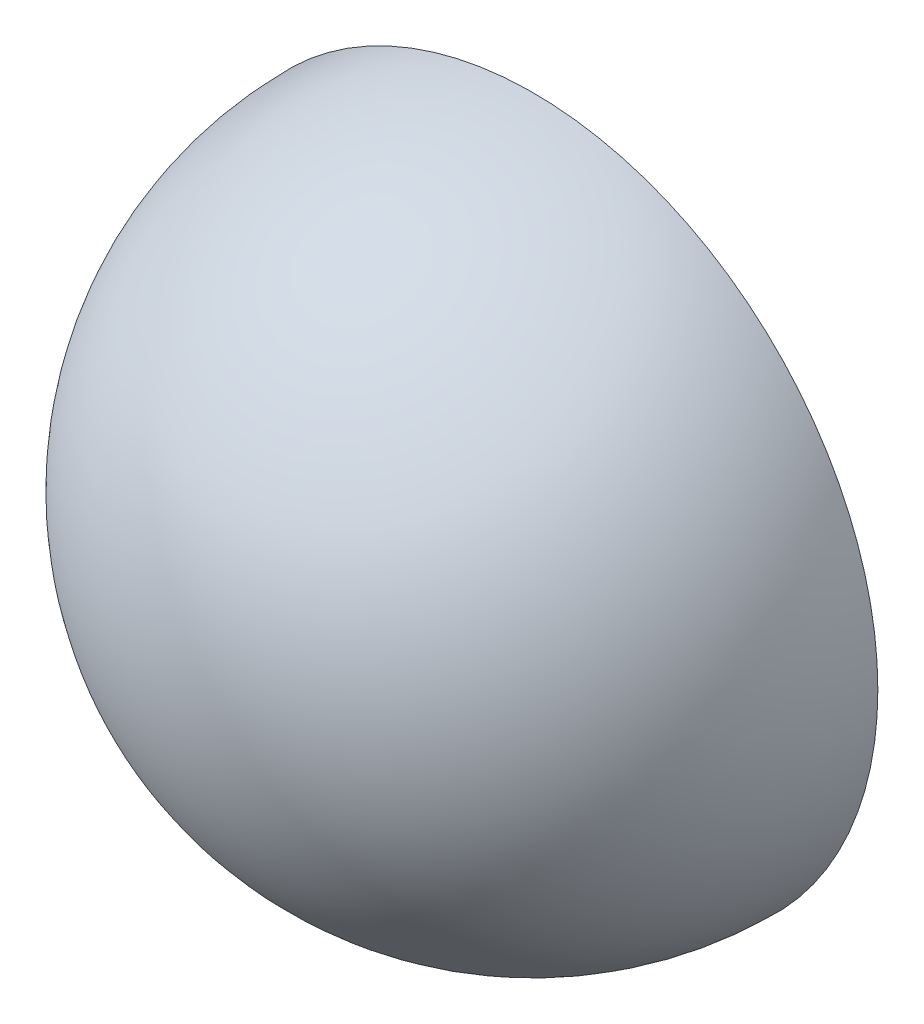
ISO-10303-21;
HEADER;
FILE_DESCRIPTION(('STEP AP214'),'2;1');
FILE_NAME('part.step','',(''),(''),'','','');
FILE_SCHEMA(('AUTOMOTIVE_DESIGN { 1 0 10303 214 1 1 1 1 }'));
ENDSEC;
DATA;
#1=APPLICATION_CONTEXT('core data for automotive mechanical design processes');
#2=APPLICATION_PROTOCOL_DEFINITION('international standard','automotive_design',2000,#1);
#3=PRODUCT_CONTEXT('',#1,'mechanical');
#4=PRODUCT('Part','Part','',(#3));
#5=PRODUCT_RELATED_PRODUCT_CATEGORY('part','',(#4));
#6=PRODUCT_DEFINITION_FORMATION('','',#4);
#7=PRODUCT_DEFINITION_CONTEXT('part definition',#1,'design');
#8=PRODUCT_DEFINITION('design','',#6,#7);
#9=PRODUCT_DEFINITION_SHAPE('','',#8);
#10=(LENGTH_UNIT() NAMED_UNIT(*) SI_UNIT(.MILLI.,.METRE.));
#11=(NAMED_UNIT(*) PLANE_ANGLE_UNIT() SI_UNIT($,.RADIAN.));
#12=(NAMED_UNIT(*) SI_UNIT($,.STERADIAN.) SOLID_ANGLE_UNIT());
#13=UNCERTAINTY_MEASURE_WITH_UNIT(LENGTH_MEASURE(1.E-05),#10,'distance_accuracy_value','');
#14=(GEOMETRIC_REPRESENTATION_CONTEXT(3) GLOBAL_UNCERTAINTY_ASSIGNED_CONTEXT((#13)) GLOBAL_UNIT_ASSIGNED_CONTEXT((#10,
#11,#12)) REPRESENTATION_CONTEXT('',''));
#15=CARTESIAN_POINT('',(0.,0.,0.));
#16=DIRECTION('',(0.,0.,1.));
#17=DIRECTION('',(1.,0.,0.));
#18=AXIS2_PLACEMENT_3D('',#15,#16,#17);
#19=CARTESIAN_POINT('',(2.54,2.54,0.));
#20=DIRECTION('',(0.,0.,1.));
#21=DIRECTION('',(1.,-5.14762711623096E-10,0.));
#22=AXIS2_PLACEMENT_3D('',#19,#20,#21);
#23=SPHERICAL_SURFACE('',#22,0.4064);
#24=CARTESIAN_POINT('',(2.54,2.54,0.));
#25=DIRECTION('',(0.,0.,1.));
#26=DIRECTION('',(1.,0.,0.));
#27=AXIS2_PLACEMENT_3D('',#24,#25,#26);
#28=CIRCLE('',#27,0.4064);
#29=CARTESIAN_POINT('',(2.9464,2.54,0.));
#30=VERTEX_POINT('',#29);
#31=EDGE_CURVE('E11',#30,#30,#28,.T.);
#32=ORIENTED_EDGE('',*,*,#31,.T.);
#33=CARTESIAN_POINT('',(2.9464,2.54,0.));
#34=CARTESIAN_POINT('',(2.9464,2.54,0.106395271201575));
#35=CARTESIAN_POINT('',(2.9129826684013,2.54,0.21278148988657));
#36=CARTESIAN_POINT('',(2.8460964768138,2.54,0.306096476813773));
#37=CARTESIAN_POINT('',(2.7527814898866,2.54,0.372982668401361));
#38=CARTESIAN_POINT('',(2.6463952712016,2.54,0.4064));
#39=CARTESIAN_POINT('',(2.54,2.54,0.4064));
#40=B_SPLINE_CURVE_WITH_KNOTS('',6,(#33,#34,#35,#36,#37,#38,#39),.UNSPECIFIED.,.F.,.F.,(7,7),
(0.,1.5707963267949),.UNSPECIFIED.);
#41=CARTESIAN_POINT('',(2.54,2.54,0.4064));
#42=VERTEX_POINT('',#41);
#43=EDGE_CURVE('E24',#30,#42,#40,.T.);
#44=ORIENTED_EDGE('',*,*,#43,.T.);
#45=ORIENTED_EDGE('',*,*,#43,.F.);
#46=EDGE_LOOP('',(#32,#44,#45));
#47=FACE_BOUND('',#46,.T.);
#48=ADVANCED_FACE('F17',(#47),#23,.T.);
#49=CARTESIAN_POINT('',(0.,0.,0.));
#50=DIRECTION('',(0.,0.,1.));
#51=DIRECTION('',(1.,0.,0.));
#52=AXIS2_PLACEMENT_3D('',#49,#50,#51);
#53=PLANE('',#52);
#54=ORIENTED_EDGE('',*,*,#31,.F.);
#55=EDGE_LOOP('',(#54));
#56=FACE_BOUND('',#55,.T.);
#57=ADVANCED_FACE('F36',(#56),#53,.F.);
#58=CLOSED_SHELL('',(#48,#57));
#59=MANIFOLD_SOLID_BREP('B1',#58);
#60=ADVANCED_BREP_SHAPE_REPRESENTATION('',(#18,#59),#14);
#61=SHAPE_DEFINITION_REPRESENTATION(#9,#60);
ENDSEC;
END-ISO-10303-21;
